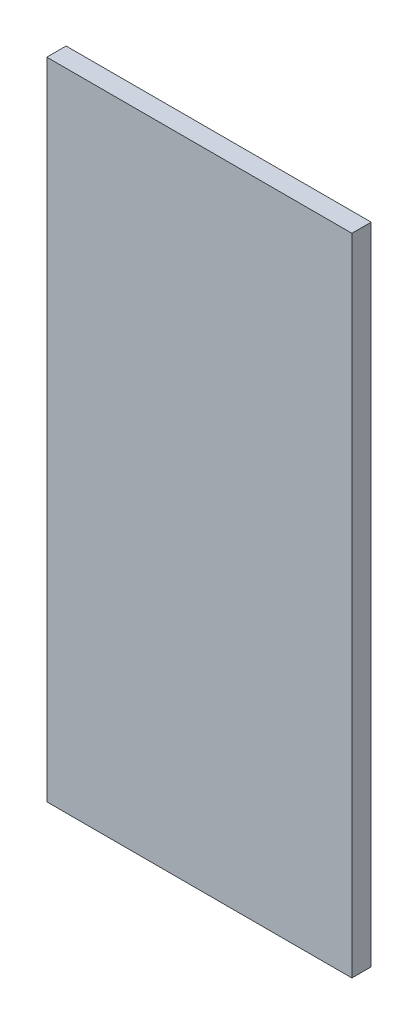
ISO-10303-21;
HEADER;
FILE_DESCRIPTION(('STEP AP214'),'2;1');
FILE_NAME('part.step','',(''),(''),'','','');
FILE_SCHEMA(('AUTOMOTIVE_DESIGN { 1 0 10303 214 1 1 1 1 }'));
ENDSEC;
DATA;
#1=APPLICATION_CONTEXT('core data for automotive mechanical design processes');
#2=APPLICATION_PROTOCOL_DEFINITION('international standard','automotive_design',2000,#1);
#3=PRODUCT_CONTEXT('',#1,'mechanical');
#4=PRODUCT('Part','Part','',(#3));
#5=PRODUCT_RELATED_PRODUCT_CATEGORY('part','',(#4));
#6=PRODUCT_DEFINITION_FORMATION('','',#4);
#7=PRODUCT_DEFINITION_CONTEXT('part definition',#1,'design');
#8=PRODUCT_DEFINITION('design','',#6,#7);
#9=PRODUCT_DEFINITION_SHAPE('','',#8);
#10=(LENGTH_UNIT() NAMED_UNIT(*) SI_UNIT(.MILLI.,.METRE.));
#11=(NAMED_UNIT(*) PLANE_ANGLE_UNIT() SI_UNIT($,.RADIAN.));
#12=(NAMED_UNIT(*) SI_UNIT($,.STERADIAN.) SOLID_ANGLE_UNIT());
#13=UNCERTAINTY_MEASURE_WITH_UNIT(LENGTH_MEASURE(1.E-05),#10,'distance_accuracy_value','');
#14=(GEOMETRIC_REPRESENTATION_CONTEXT(3) GLOBAL_UNCERTAINTY_ASSIGNED_CONTEXT((#13)) GLOBAL_UNIT_ASSIGNED_CONTEXT((#10,
#11,#12)) REPRESENTATION_CONTEXT('',''));
#15=CARTESIAN_POINT('',(0.,0.,0.));
#16=DIRECTION('',(0.,0.,1.));
#17=DIRECTION('',(1.,0.,0.));
#18=AXIS2_PLACEMENT_3D('',#15,#16,#17);
#19=CARTESIAN_POINT('',(-395.,-350.,50.));
#20=DIRECTION('',(1.,0.,0.));
#21=DIRECTION('',(0.,0.,-1.));
#22=AXIS2_PLACEMENT_3D('',#19,#20,#21);
#23=PLANE('',#22);
#24=DIRECTION('',(0.,-1.,0.));
#25=VECTOR('',#24,1.);
#26=CARTESIAN_POINT('',(-395.,-350.,0.));
#27=LINE('',#26,#25);
#28=CARTESIAN_POINT('',(-395.,1320.,0.));
#29=VERTEX_POINT('',#28);
#30=CARTESIAN_POINT('',(-395.,-350.,0.));
#31=VERTEX_POINT('',#30);
#32=EDGE_CURVE('E96',#29,#31,#27,.T.);
#33=ORIENTED_EDGE('',*,*,#32,.T.);
#34=DIRECTION('',(0.,0.,-1.));
#35=VECTOR('',#34,1.);
#36=CARTESIAN_POINT('',(-395.,-350.,50.));
#37=LINE('',#36,#35);
#38=CARTESIAN_POINT('',(-395.,-350.,50.));
#39=VERTEX_POINT('',#38);
#40=EDGE_CURVE('E11',#39,#31,#37,.T.);
#41=ORIENTED_EDGE('',*,*,#40,.F.);
#42=DIRECTION('',(0.,-1.,0.));
#43=VECTOR('',#42,1.);
#44=CARTESIAN_POINT('',(-395.,-350.,50.));
#45=LINE('',#44,#43);
#46=CARTESIAN_POINT('',(-395.,1320.,50.));
#47=VERTEX_POINT('',#46);
#48=EDGE_CURVE('E84',#47,#39,#45,.T.);
#49=ORIENTED_EDGE('',*,*,#48,.F.);
#50=DIRECTION('',(0.,0.,-1.));
#51=VECTOR('',#50,1.);
#52=CARTESIAN_POINT('',(-395.,1320.,50.));
#53=LINE('',#52,#51);
#54=EDGE_CURVE('E92',#47,#29,#53,.T.);
#55=ORIENTED_EDGE('',*,*,#54,.T.);
#56=EDGE_LOOP('',(#33,#41,#49,#55));
#57=FACE_BOUND('',#56,.T.);
#58=ADVANCED_FACE('F33',(#57),#23,.F.);
#59=CARTESIAN_POINT('',(395.,-350.,50.));
#60=DIRECTION('',(0.,1.,0.));
#61=DIRECTION('',(0.,0.,1.));
#62=AXIS2_PLACEMENT_3D('',#59,#60,#61);
#63=PLANE('',#62);
#64=DIRECTION('',(1.,0.,0.));
#65=VECTOR('',#64,1.);
#66=CARTESIAN_POINT('',(395.,-350.,0.));
#67=LINE('',#66,#65);
#68=CARTESIAN_POINT('',(395.,-350.,0.));
#69=VERTEX_POINT('',#68);
#70=EDGE_CURVE('E88',#31,#69,#67,.T.);
#71=ORIENTED_EDGE('',*,*,#70,.T.);
#72=DIRECTION('',(0.,0.,-1.));
#73=VECTOR('',#72,1.);
#74=CARTESIAN_POINT('',(395.,-350.,50.));
#75=LINE('',#74,#73);
#76=CARTESIAN_POINT('',(395.,-350.,50.));
#77=VERTEX_POINT('',#76);
#78=EDGE_CURVE('E41',#77,#69,#75,.T.);
#79=ORIENTED_EDGE('',*,*,#78,.F.);
#80=DIRECTION('',(1.,0.,0.));
#81=VECTOR('',#80,1.);
#82=CARTESIAN_POINT('',(395.,-350.,50.));
#83=LINE('',#82,#81);
#84=EDGE_CURVE('E79',#39,#77,#83,.T.);
#85=ORIENTED_EDGE('',*,*,#84,.F.);
#86=ORIENTED_EDGE('',*,*,#40,.T.);
#87=EDGE_LOOP('',(#71,#79,#85,#86));
#88=FACE_BOUND('',#87,.T.);
#89=ADVANCED_FACE('F87',(#88),#63,.F.);
#90=CARTESIAN_POINT('',(395.,-350.,50.));
#91=DIRECTION('',(-1.,0.,0.));
#92=DIRECTION('',(0.,0.,1.));
#93=AXIS2_PLACEMENT_3D('',#90,#91,#92);
#94=PLANE('',#93);
#95=DIRECTION('',(0.,1.,0.));
#96=VECTOR('',#95,1.);
#97=CARTESIAN_POINT('',(395.,-350.,0.));
#98=LINE('',#97,#96);
#99=CARTESIAN_POINT('',(395.,1320.,0.));
#100=VERTEX_POINT('',#99);
#101=EDGE_CURVE('E66',#69,#100,#98,.T.);
#102=ORIENTED_EDGE('',*,*,#101,.T.);
#103=DIRECTION('',(0.,0.,-1.));
#104=VECTOR('',#103,1.);
#105=CARTESIAN_POINT('',(395.,1320.,50.));
#106=LINE('',#105,#104);
#107=CARTESIAN_POINT('',(395.,1320.,50.));
#108=VERTEX_POINT('',#107);
#109=EDGE_CURVE('E89',#108,#100,#106,.T.);
#110=ORIENTED_EDGE('',*,*,#109,.F.);
#111=DIRECTION('',(0.,1.,0.));
#112=VECTOR('',#111,1.);
#113=CARTESIAN_POINT('',(395.,-350.,50.));
#114=LINE('',#113,#112);
#115=EDGE_CURVE('E82',#77,#108,#114,.T.);
#116=ORIENTED_EDGE('',*,*,#115,.F.);
#117=ORIENTED_EDGE('',*,*,#78,.T.);
#118=EDGE_LOOP('',(#102,#110,#116,#117));
#119=FACE_BOUND('',#118,.T.);
#120=ADVANCED_FACE('F90',(#119),#94,.F.);
#121=CARTESIAN_POINT('',(395.,1320.,50.));
#122=DIRECTION('',(0.,-1.,0.));
#123=DIRECTION('',(0.,0.,-1.));
#124=AXIS2_PLACEMENT_3D('',#121,#122,#123);
#125=PLANE('',#124);
#126=DIRECTION('',(-1.,0.,0.));
#127=VECTOR('',#126,1.);
#128=CARTESIAN_POINT('',(395.,1320.,0.));
#129=LINE('',#128,#127);
#130=EDGE_CURVE('E72',#100,#29,#129,.T.);
#131=ORIENTED_EDGE('',*,*,#130,.T.);
#132=ORIENTED_EDGE('',*,*,#54,.F.);
#133=DIRECTION('',(-1.,0.,0.));
#134=VECTOR('',#133,1.);
#135=CARTESIAN_POINT('',(395.,1320.,50.));
#136=LINE('',#135,#134);
#137=EDGE_CURVE('E49',#108,#47,#136,.T.);
#138=ORIENTED_EDGE('',*,*,#137,.F.);
#139=ORIENTED_EDGE('',*,*,#109,.T.);
#140=EDGE_LOOP('',(#131,#132,#138,#139));
#141=FACE_BOUND('',#140,.T.);
#142=ADVANCED_FACE('F103',(#141),#125,.F.);
#143=CARTESIAN_POINT('',(0.,0.,50.));
#144=DIRECTION('',(0.,0.,1.));
#145=DIRECTION('',(1.,0.,0.));
#146=AXIS2_PLACEMENT_3D('',#143,#144,#145);
#147=PLANE('',#146);
#148=ORIENTED_EDGE('',*,*,#48,.T.);
#149=ORIENTED_EDGE('',*,*,#84,.T.);
#150=ORIENTED_EDGE('',*,*,#115,.T.);
#151=ORIENTED_EDGE('',*,*,#137,.T.);
#152=EDGE_LOOP('',(#148,#149,#150,#151));
#153=FACE_BOUND('',#152,.T.);
#154=ADVANCED_FACE('F80',(#153),#147,.T.);
#155=CARTESIAN_POINT('',(0.,0.,0.));
#156=DIRECTION('',(0.,0.,1.));
#157=DIRECTION('',(1.,0.,0.));
#158=AXIS2_PLACEMENT_3D('',#155,#156,#157);
#159=PLANE('',#158);
#160=ORIENTED_EDGE('',*,*,#32,.F.);
#161=ORIENTED_EDGE('',*,*,#130,.F.);
#162=ORIENTED_EDGE('',*,*,#101,.F.);
#163=ORIENTED_EDGE('',*,*,#70,.F.);
#164=EDGE_LOOP('',(#160,#161,#162,#163));
#165=FACE_BOUND('',#164,.T.);
#166=ADVANCED_FACE('F106',(#165),#159,.F.);
#167=CLOSED_SHELL('',(#58,#89,#120,#142,#154,#166));
#168=MANIFOLD_SOLID_BREP('B2',#167);
#169=ADVANCED_BREP_SHAPE_REPRESENTATION('',(#18,#168),#14);
#170=SHAPE_DEFINITION_REPRESENTATION(#9,#169);
ENDSEC;
END-ISO-10303-21;
